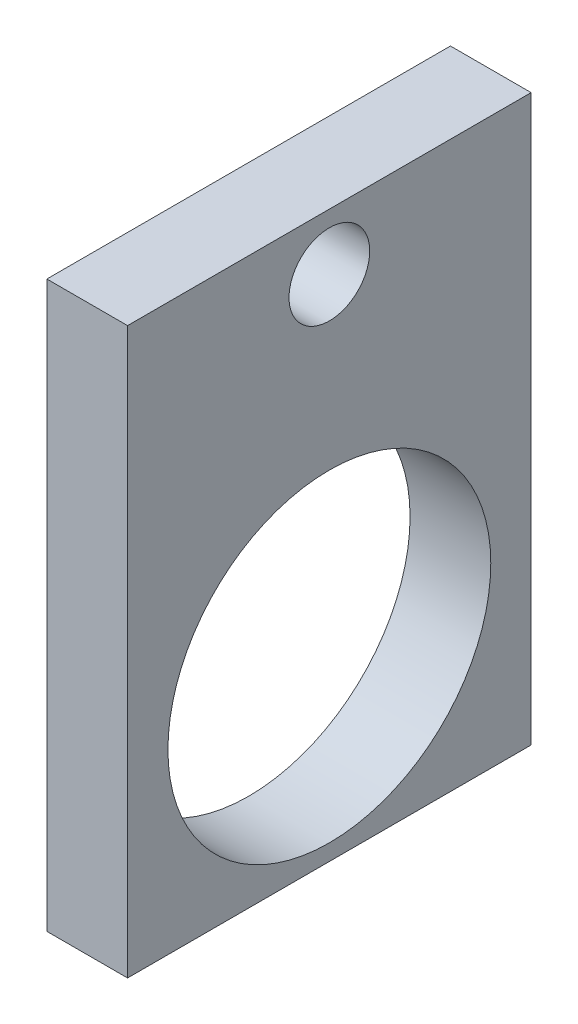
ISO-10303-21;
HEADER;
FILE_DESCRIPTION(('STEP AP214'),'2;1');
FILE_NAME('part.step','',(''),(''),'','','');
FILE_SCHEMA(('AUTOMOTIVE_DESIGN { 1 0 10303 214 1 1 1 1 }'));
ENDSEC;
DATA;
#1=APPLICATION_CONTEXT('core data for automotive mechanical design processes');
#2=APPLICATION_PROTOCOL_DEFINITION('international standard','automotive_design',2000,#1);
#3=PRODUCT_CONTEXT('',#1,'mechanical');
#4=PRODUCT('Part','Part','',(#3));
#5=PRODUCT_RELATED_PRODUCT_CATEGORY('part','',(#4));
#6=PRODUCT_DEFINITION_FORMATION('','',#4);
#7=PRODUCT_DEFINITION_CONTEXT('part definition',#1,'design');
#8=PRODUCT_DEFINITION('design','',#6,#7);
#9=PRODUCT_DEFINITION_SHAPE('','',#8);
#10=(LENGTH_UNIT() NAMED_UNIT(*) SI_UNIT(.MILLI.,.METRE.));
#11=(NAMED_UNIT(*) PLANE_ANGLE_UNIT() SI_UNIT($,.RADIAN.));
#12=(NAMED_UNIT(*) SI_UNIT($,.STERADIAN.) SOLID_ANGLE_UNIT());
#13=UNCERTAINTY_MEASURE_WITH_UNIT(LENGTH_MEASURE(1.E-05),#10,'distance_accuracy_value','');
#14=(GEOMETRIC_REPRESENTATION_CONTEXT(3) GLOBAL_UNCERTAINTY_ASSIGNED_CONTEXT((#13)) GLOBAL_UNIT_ASSIGNED_CONTEXT((#10,
#11,#12)) REPRESENTATION_CONTEXT('',''));
#15=CARTESIAN_POINT('',(0.,0.,0.));
#16=DIRECTION('',(0.,0.,1.));
#17=DIRECTION('',(1.,0.,0.));
#18=AXIS2_PLACEMENT_3D('',#15,#16,#17);
#19=CARTESIAN_POINT('',(6.35,-22.225,0.));
#20=DIRECTION('',(0.,1.,0.));
#21=DIRECTION('',(0.,0.,1.));
#22=AXIS2_PLACEMENT_3D('',#19,#20,#21);
#23=PLANE('',#22);
#24=DIRECTION('',(0.,0.,-1.));
#25=VECTOR('',#24,1.);
#26=CARTESIAN_POINT('',(0.,-22.225,0.));
#27=LINE('',#26,#25);
#28=CARTESIAN_POINT('',(0.,-22.225,15.875));
#29=VERTEX_POINT('',#28);
#30=CARTESIAN_POINT('',(0.,-22.225,-15.875));
#31=VERTEX_POINT('',#30);
#32=EDGE_CURVE('E105',#29,#31,#27,.T.);
#33=ORIENTED_EDGE('',*,*,#32,.T.);
#34=DIRECTION('',(-1.,0.,0.));
#35=VECTOR('',#34,1.);
#36=CARTESIAN_POINT('',(6.35,-22.225,-15.875));
#37=LINE('',#36,#35);
#38=CARTESIAN_POINT('',(6.35,-22.225,-15.875));
#39=VERTEX_POINT('',#38);
#40=EDGE_CURVE('E11',#39,#31,#37,.T.);
#41=ORIENTED_EDGE('',*,*,#40,.F.);
#42=DIRECTION('',(0.,0.,-1.));
#43=VECTOR('',#42,1.);
#44=CARTESIAN_POINT('',(6.35,-22.225,0.));
#45=LINE('',#44,#43);
#46=CARTESIAN_POINT('',(6.35,-22.225,15.875));
#47=VERTEX_POINT('',#46);
#48=EDGE_CURVE('E75',#47,#39,#45,.T.);
#49=ORIENTED_EDGE('',*,*,#48,.F.);
#50=DIRECTION('',(-1.,0.,0.));
#51=VECTOR('',#50,1.);
#52=CARTESIAN_POINT('',(6.35,-22.225,15.875));
#53=LINE('',#52,#51);
#54=EDGE_CURVE('E101',#47,#29,#53,.T.);
#55=ORIENTED_EDGE('',*,*,#54,.T.);
#56=EDGE_LOOP('',(#33,#41,#49,#55));
#57=FACE_BOUND('',#56,.T.);
#58=ADVANCED_FACE('F35',(#57),#23,.F.);
#59=CARTESIAN_POINT('',(6.35,0.,-15.875));
#60=DIRECTION('',(0.,0.,-1.));
#61=DIRECTION('',(0.,1.,0.));
#62=AXIS2_PLACEMENT_3D('',#59,#60,#61);
#63=PLANE('',#62);
#64=DIRECTION('',(0.,-1.,0.));
#65=VECTOR('',#64,1.);
#66=CARTESIAN_POINT('',(0.,0.,-15.875));
#67=LINE('',#66,#65);
#68=CARTESIAN_POINT('',(0.,22.225,-15.875));
#69=VERTEX_POINT('',#68);
#70=EDGE_CURVE('E84',#69,#31,#67,.T.);
#71=ORIENTED_EDGE('',*,*,#70,.F.);
#72=DIRECTION('',(-1.,0.,0.));
#73=VECTOR('',#72,1.);
#74=CARTESIAN_POINT('',(6.35,22.225,-15.875));
#75=LINE('',#74,#73);
#76=CARTESIAN_POINT('',(6.35,22.225,-15.875));
#77=VERTEX_POINT('',#76);
#78=EDGE_CURVE('E44',#77,#69,#75,.T.);
#79=ORIENTED_EDGE('',*,*,#78,.F.);
#80=DIRECTION('',(0.,-1.,0.));
#81=VECTOR('',#80,1.);
#82=CARTESIAN_POINT('',(6.35,0.,-15.875));
#83=LINE('',#82,#81);
#84=EDGE_CURVE('E82',#77,#39,#83,.T.);
#85=ORIENTED_EDGE('',*,*,#84,.T.);
#86=ORIENTED_EDGE('',*,*,#40,.T.);
#87=EDGE_LOOP('',(#71,#79,#85,#86));
#88=FACE_BOUND('',#87,.T.);
#89=ADVANCED_FACE('F81',(#88),#63,.T.);
#90=CARTESIAN_POINT('',(6.35,22.225,0.));
#91=DIRECTION('',(0.,1.,0.));
#92=DIRECTION('',(0.,0.,1.));
#93=AXIS2_PLACEMENT_3D('',#90,#91,#92);
#94=PLANE('',#93);
#95=DIRECTION('',(0.,0.,-1.));
#96=VECTOR('',#95,1.);
#97=CARTESIAN_POINT('',(0.,22.225,0.));
#98=LINE('',#97,#96);
#99=CARTESIAN_POINT('',(0.,22.225,15.875));
#100=VERTEX_POINT('',#99);
#101=EDGE_CURVE('E109',#100,#69,#98,.T.);
#102=ORIENTED_EDGE('',*,*,#101,.F.);
#103=DIRECTION('',(-1.,0.,0.));
#104=VECTOR('',#103,1.);
#105=CARTESIAN_POINT('',(6.35,22.225,15.875));
#106=LINE('',#105,#104);
#107=CARTESIAN_POINT('',(6.35,22.225,15.875));
#108=VERTEX_POINT('',#107);
#109=EDGE_CURVE('E67',#108,#100,#106,.T.);
#110=ORIENTED_EDGE('',*,*,#109,.F.);
#111=DIRECTION('',(0.,0.,-1.));
#112=VECTOR('',#111,1.);
#113=CARTESIAN_POINT('',(6.35,22.225,0.));
#114=LINE('',#113,#112);
#115=EDGE_CURVE('E91',#108,#77,#114,.T.);
#116=ORIENTED_EDGE('',*,*,#115,.T.);
#117=ORIENTED_EDGE('',*,*,#78,.T.);
#118=EDGE_LOOP('',(#102,#110,#116,#117));
#119=FACE_BOUND('',#118,.T.);
#120=ADVANCED_FACE('F93',(#119),#94,.T.);
#121=CARTESIAN_POINT('',(6.35,0.,15.875));
#122=DIRECTION('',(0.,0.,-1.));
#123=DIRECTION('',(-1.,0.,0.));
#124=AXIS2_PLACEMENT_3D('',#121,#122,#123);
#125=PLANE('',#124);
#126=DIRECTION('',(0.,-1.,0.));
#127=VECTOR('',#126,1.);
#128=CARTESIAN_POINT('',(0.,0.,15.875));
#129=LINE('',#128,#127);
#130=EDGE_CURVE('E70',#100,#29,#129,.T.);
#131=ORIENTED_EDGE('',*,*,#130,.T.);
#132=ORIENTED_EDGE('',*,*,#54,.F.);
#133=DIRECTION('',(0.,-1.,0.));
#134=VECTOR('',#133,1.);
#135=CARTESIAN_POINT('',(6.35,0.,15.875));
#136=LINE('',#135,#134);
#137=EDGE_CURVE('E52',#108,#47,#136,.T.);
#138=ORIENTED_EDGE('',*,*,#137,.F.);
#139=ORIENTED_EDGE('',*,*,#109,.T.);
#140=EDGE_LOOP('',(#131,#132,#138,#139));
#141=FACE_BOUND('',#140,.T.);
#142=ADVANCED_FACE('F137',(#141),#125,.F.);
#143=CARTESIAN_POINT('',(6.35,17.78,0.));
#144=DIRECTION('',(-1.,0.,0.));
#145=DIRECTION('',(0.,0.,1.));
#146=AXIS2_PLACEMENT_3D('',#143,#144,#145);
#147=CYLINDRICAL_SURFACE('',#146,3.175);
#148=CARTESIAN_POINT('',(6.35,17.78,0.));
#149=DIRECTION('',(1.,0.,0.));
#150=DIRECTION('',(0.,0.,-1.));
#151=AXIS2_PLACEMENT_3D('',#148,#149,#150);
#152=CIRCLE('',#151,3.175);
#153=CARTESIAN_POINT('',(6.35,17.78,-3.175));
#154=VERTEX_POINT('',#153);
#155=EDGE_CURVE('E115',#154,#154,#152,.T.);
#156=ORIENTED_EDGE('',*,*,#155,.T.);
#157=EDGE_LOOP('',(#156));
#158=FACE_BOUND('',#157,.T.);
#159=CARTESIAN_POINT('',(0.,17.78,0.));
#160=DIRECTION('',(1.,0.,0.));
#161=DIRECTION('',(0.,0.,-1.));
#162=AXIS2_PLACEMENT_3D('',#159,#160,#161);
#163=CIRCLE('',#162,3.175);
#164=CARTESIAN_POINT('',(0.,17.78,-3.175));
#165=VERTEX_POINT('',#164);
#166=EDGE_CURVE('E102',#165,#165,#163,.T.);
#167=ORIENTED_EDGE('',*,*,#166,.F.);
#168=EDGE_LOOP('',(#167));
#169=FACE_BOUND('',#168,.T.);
#170=ADVANCED_FACE('F37',(#158,#169),#147,.F.);
#171=CARTESIAN_POINT('',(6.35,-8.25500000000003,0.));
#172=DIRECTION('',(-1.,0.,0.));
#173=DIRECTION('',(0.,0.,1.));
#174=AXIS2_PLACEMENT_3D('',#171,#172,#173);
#175=CYLINDRICAL_SURFACE('',#174,12.7);
#176=CARTESIAN_POINT('',(6.35,-8.25500000000003,0.));
#177=DIRECTION('',(1.,0.,0.));
#178=DIRECTION('',(0.,0.,-1.));
#179=AXIS2_PLACEMENT_3D('',#176,#177,#178);
#180=CIRCLE('',#179,12.7);
#181=CARTESIAN_POINT('',(6.35,-8.25500000000003,-12.7));
#182=VERTEX_POINT('',#181);
#183=EDGE_CURVE('E95',#182,#182,#180,.T.);
#184=ORIENTED_EDGE('',*,*,#183,.T.);
#185=EDGE_LOOP('',(#184));
#186=FACE_BOUND('',#185,.T.);
#187=CARTESIAN_POINT('',(0.,-8.25500000000003,0.));
#188=DIRECTION('',(1.,0.,0.));
#189=DIRECTION('',(0.,0.,-1.));
#190=AXIS2_PLACEMENT_3D('',#187,#188,#189);
#191=CIRCLE('',#190,12.7);
#192=CARTESIAN_POINT('',(0.,-8.25500000000003,-12.7));
#193=VERTEX_POINT('',#192);
#194=EDGE_CURVE('E112',#193,#193,#191,.T.);
#195=ORIENTED_EDGE('',*,*,#194,.F.);
#196=EDGE_LOOP('',(#195));
#197=FACE_BOUND('',#196,.T.);
#198=ADVANCED_FACE('F127',(#186,#197),#175,.F.);
#199=CARTESIAN_POINT('',(6.35,0.,0.));
#200=DIRECTION('',(1.,0.,0.));
#201=DIRECTION('',(0.,0.,-1.));
#202=AXIS2_PLACEMENT_3D('',#199,#200,#201);
#203=PLANE('',#202);
#204=ORIENTED_EDGE('',*,*,#155,.F.);
#205=EDGE_LOOP('',(#204));
#206=FACE_BOUND('',#205,.T.);
#207=ORIENTED_EDGE('',*,*,#48,.T.);
#208=ORIENTED_EDGE('',*,*,#84,.F.);
#209=ORIENTED_EDGE('',*,*,#115,.F.);
#210=ORIENTED_EDGE('',*,*,#137,.T.);
#211=EDGE_LOOP('',(#207,#208,#209,#210));
#212=FACE_BOUND('',#211,.T.);
#213=ORIENTED_EDGE('',*,*,#183,.F.);
#214=EDGE_LOOP('',(#213));
#215=FACE_BOUND('',#214,.T.);
#216=ADVANCED_FACE('F89',(#206,#212,#215),#203,.T.);
#217=CARTESIAN_POINT('',(0.,0.,0.));
#218=DIRECTION('',(1.,0.,0.));
#219=DIRECTION('',(0.,0.,-1.));
#220=AXIS2_PLACEMENT_3D('',#217,#218,#219);
#221=PLANE('',#220);
#222=ORIENTED_EDGE('',*,*,#166,.T.);
#223=EDGE_LOOP('',(#222));
#224=FACE_BOUND('',#223,.T.);
#225=ORIENTED_EDGE('',*,*,#32,.F.);
#226=ORIENTED_EDGE('',*,*,#130,.F.);
#227=ORIENTED_EDGE('',*,*,#101,.T.);
#228=ORIENTED_EDGE('',*,*,#70,.T.);
#229=EDGE_LOOP('',(#225,#226,#227,#228));
#230=FACE_BOUND('',#229,.T.);
#231=ORIENTED_EDGE('',*,*,#194,.T.);
#232=EDGE_LOOP('',(#231));
#233=FACE_BOUND('',#232,.T.);
#234=ADVANCED_FACE('F120',(#224,#230,#233),#221,.F.);
#235=CLOSED_SHELL('',(#58,#89,#120,#142,#170,#198,#216,#234));
#236=MANIFOLD_SOLID_BREP('B2',#235);
#237=ADVANCED_BREP_SHAPE_REPRESENTATION('',(#18,#236),#14);
#238=SHAPE_DEFINITION_REPRESENTATION(#9,#237);
ENDSEC;
END-ISO-10303-21;
